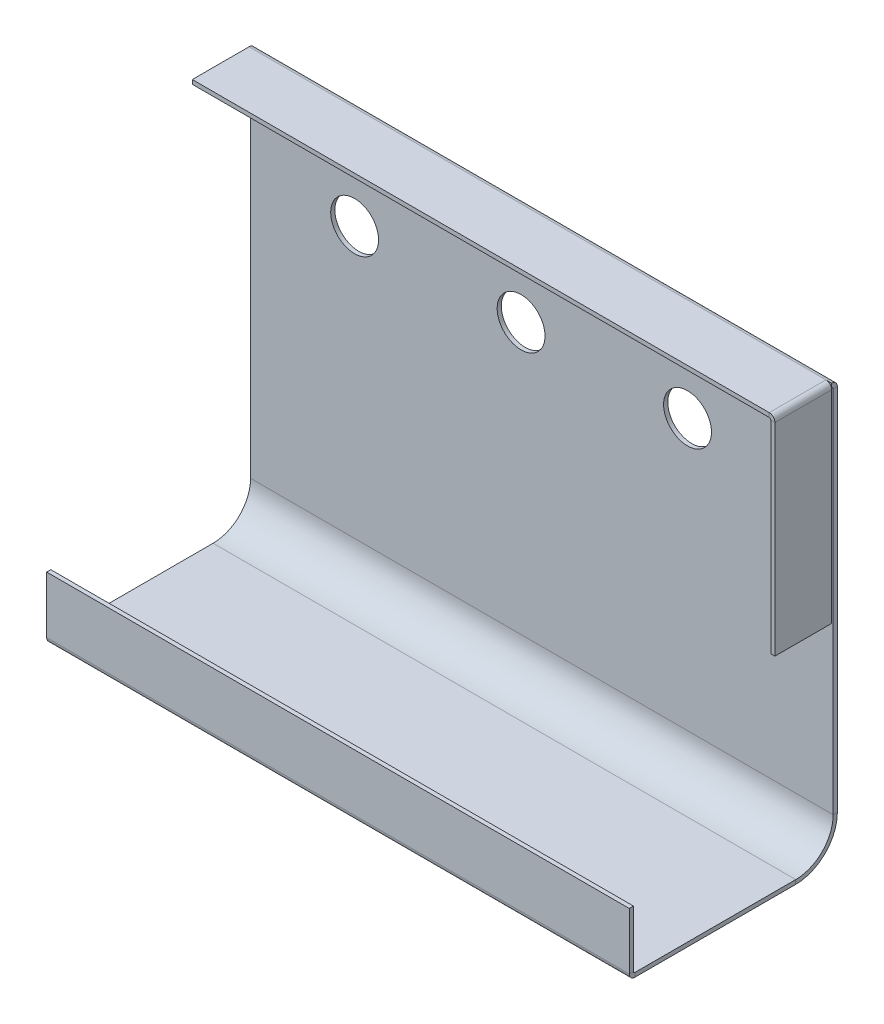
ISO-10303-21;
HEADER;
FILE_DESCRIPTION(('STEP AP214'),'2;1');
FILE_NAME('part.step','',(''),(''),'','','');
FILE_SCHEMA(('AUTOMOTIVE_DESIGN { 1 0 10303 214 1 1 1 1 }'));
ENDSEC;
DATA;
#1=APPLICATION_CONTEXT('core data for automotive mechanical design processes');
#2=APPLICATION_PROTOCOL_DEFINITION('international standard','automotive_design',2000,#1);
#3=PRODUCT_CONTEXT('',#1,'mechanical');
#4=PRODUCT('Part','Part','',(#3));
#5=PRODUCT_RELATED_PRODUCT_CATEGORY('part','',(#4));
#6=PRODUCT_DEFINITION_FORMATION('','',#4);
#7=PRODUCT_DEFINITION_CONTEXT('part definition',#1,'design');
#8=PRODUCT_DEFINITION('design','',#6,#7);
#9=PRODUCT_DEFINITION_SHAPE('','',#8);
#10=(LENGTH_UNIT() NAMED_UNIT(*) SI_UNIT(.MILLI.,.METRE.));
#11=(NAMED_UNIT(*) PLANE_ANGLE_UNIT() SI_UNIT($,.RADIAN.));
#12=(NAMED_UNIT(*) SI_UNIT($,.STERADIAN.) SOLID_ANGLE_UNIT());
#13=UNCERTAINTY_MEASURE_WITH_UNIT(LENGTH_MEASURE(1.E-05),#10,'distance_accuracy_value','');
#14=(GEOMETRIC_REPRESENTATION_CONTEXT(3) GLOBAL_UNCERTAINTY_ASSIGNED_CONTEXT((#13)) GLOBAL_UNIT_ASSIGNED_CONTEXT((#10,
#11,#12)) REPRESENTATION_CONTEXT('',''));
#15=CARTESIAN_POINT('',(0.,0.,0.));
#16=DIRECTION('',(0.,0.,1.));
#17=DIRECTION('',(1.,0.,0.));
#18=AXIS2_PLACEMENT_3D('',#15,#16,#17);
#19=CARTESIAN_POINT('',(137.2634,98.0000000000001,0.736600000000007));
#20=DIRECTION('',(0.,0.,1.));
#21=DIRECTION('',(0.,-1.,0.));
#22=AXIS2_PLACEMENT_3D('',#19,#20,#21);
#23=PLANE('',#22);
#24=DIRECTION('',(-1.,0.,0.));
#25=VECTOR('',#24,1.);
#26=CARTESIAN_POINT('',(0.,100.,0.73659999999999));
#27=LINE('',#26,#25);
#28=CARTESIAN_POINT('',(140.,100.,0.7366));
#29=VERTEX_POINT('',#28);
#30=CARTESIAN_POINT('',(137.2634,100.,0.736600000000007));
#31=VERTEX_POINT('',#30);
#32=EDGE_CURVE('E411',#29,#31,#27,.T.);
#33=ORIENTED_EDGE('',*,*,#32,.T.);
#34=CARTESIAN_POINT('',(137.2634,97.2634000000001,0.736600000000007));
#35=DIRECTION('',(0.,0.,1.));
#36=DIRECTION('',(1.,0.,0.));
#37=AXIS2_PLACEMENT_3D('',#34,#35,#36);
#38=CIRCLE('',#37,2.7366);
#39=CARTESIAN_POINT('',(139.899002397935,98.,0.736600000000007));
#40=VERTEX_POINT('',#39);
#41=EDGE_CURVE('E315',#31,#40,#38,.F.);
#42=ORIENTED_EDGE('',*,*,#41,.T.);
#43=DIRECTION('',(1.,0.,0.));
#44=VECTOR('',#43,1.);
#45=CARTESIAN_POINT('',(140.,98.,0.736600000000004));
#46=LINE('',#45,#44);
#47=CARTESIAN_POINT('',(140.,98.,0.736600000000007));
#48=VERTEX_POINT('',#47);
#49=EDGE_CURVE('E418',#48,#40,#46,.F.);
#50=ORIENTED_EDGE('',*,*,#49,.F.);
#51=DIRECTION('',(0.,1.,0.));
#52=VECTOR('',#51,1.);
#53=CARTESIAN_POINT('',(140.,100.,0.736599999999997));
#54=LINE('',#53,#52);
#55=EDGE_CURVE('E394',#48,#29,#54,.T.);
#56=ORIENTED_EDGE('',*,*,#55,.T.);
#57=EDGE_LOOP('',(#33,#42,#50,#56));
#58=FACE_BOUND('',#57,.T.);
#59=ADVANCED_FACE('F119',(#58),#23,.T.);
#60=CARTESIAN_POINT('',(0.,100.,-3.53927657873048E-13));
#61=DIRECTION('',(0.,1.,0.));
#62=DIRECTION('',(0.,0.,1.));
#63=AXIS2_PLACEMENT_3D('',#60,#61,#62);
#64=PLANE('',#63);
#65=DIRECTION('',(-1.,0.,0.));
#66=VECTOR('',#65,1.);
#67=CARTESIAN_POINT('',(-140.,100.,28.));
#68=LINE('',#67,#66);
#69=CARTESIAN_POINT('',(137.2634,100.,28.));
#70=VERTEX_POINT('',#69);
#71=CARTESIAN_POINT('',(-140.,100.,28.));
#72=VERTEX_POINT('',#71);
#73=EDGE_CURVE('E404',#70,#72,#68,.T.);
#74=ORIENTED_EDGE('',*,*,#73,.F.);
#75=DIRECTION('',(0.,0.,1.));
#76=VECTOR('',#75,1.);
#77=CARTESIAN_POINT('',(137.2634,100.,28.));
#78=LINE('',#77,#76);
#79=EDGE_CURVE('E310',#70,#31,#78,.F.);
#80=ORIENTED_EDGE('',*,*,#79,.T.);
#81=CARTESIAN_POINT('',(-140.,100.,0.736599999999983));
#82=VERTEX_POINT('',#81);
#83=EDGE_CURVE('E414',#31,#82,#27,.T.);
#84=ORIENTED_EDGE('',*,*,#83,.T.);
#85=DIRECTION('',(0.,0.,-1.));
#86=VECTOR('',#85,1.);
#87=CARTESIAN_POINT('',(-140.,100.,0.));
#88=LINE('',#87,#86);
#89=EDGE_CURVE('E401',#72,#82,#88,.T.);
#90=ORIENTED_EDGE('',*,*,#89,.F.);
#91=EDGE_LOOP('',(#74,#80,#84,#90));
#92=FACE_BOUND('',#91,.T.);
#93=ADVANCED_FACE('F536',(#92),#64,.T.);
#94=CARTESIAN_POINT('',(0.,98.,-3.46944695195361E-13));
#95=DIRECTION('',(0.,1.,0.));
#96=DIRECTION('',(0.,0.,1.));
#97=AXIS2_PLACEMENT_3D('',#94,#95,#96);
#98=PLANE('',#97);
#99=DIRECTION('',(0.,0.,1.));
#100=VECTOR('',#99,1.);
#101=CARTESIAN_POINT('',(137.2634,98.0000000000001,28.));
#102=LINE('',#101,#100);
#103=CARTESIAN_POINT('',(137.2634,98.0000000000001,28.));
#104=VERTEX_POINT('',#103);
#105=CARTESIAN_POINT('',(137.2634,98.0000000000001,0.736600000000007));
#106=VERTEX_POINT('',#105);
#107=EDGE_CURVE('E324',#104,#106,#102,.F.);
#108=ORIENTED_EDGE('',*,*,#107,.F.);
#109=DIRECTION('',(1.,0.,0.));
#110=VECTOR('',#109,1.);
#111=CARTESIAN_POINT('',(0.,98.0000000000001,28.));
#112=LINE('',#111,#110);
#113=CARTESIAN_POINT('',(-140.,98.0000000000001,28.));
#114=VERTEX_POINT('',#113);
#115=EDGE_CURVE('E409',#104,#114,#112,.F.);
#116=ORIENTED_EDGE('',*,*,#115,.T.);
#117=DIRECTION('',(0.,0.,1.));
#118=VECTOR('',#117,1.);
#119=CARTESIAN_POINT('',(-140.,98.,-3.46944695195361E-13));
#120=LINE('',#119,#118);
#121=CARTESIAN_POINT('',(-140.,98.,0.736599999999987));
#122=VERTEX_POINT('',#121);
#123=EDGE_CURVE('E406',#114,#122,#120,.F.);
#124=ORIENTED_EDGE('',*,*,#123,.T.);
#125=EDGE_CURVE('E422',#106,#122,#46,.F.);
#126=ORIENTED_EDGE('',*,*,#125,.F.);
#127=EDGE_LOOP('',(#108,#116,#124,#126));
#128=FACE_BOUND('',#127,.T.);
#129=ADVANCED_FACE('F551',(#128),#98,.F.);
#130=CARTESIAN_POINT('',(-140.,100.,28.));
#131=DIRECTION('',(0.,0.,1.));
#132=DIRECTION('',(0.,-1.,0.));
#133=AXIS2_PLACEMENT_3D('',#130,#131,#132);
#134=PLANE('',#133);
#135=ORIENTED_EDGE('',*,*,#115,.F.);
#136=DIRECTION('',(0.,1.,0.));
#137=VECTOR('',#136,1.);
#138=CARTESIAN_POINT('',(137.2634,98.0000000000001,28.));
#139=LINE('',#138,#137);
#140=EDGE_CURVE('E318',#104,#70,#139,.T.);
#141=ORIENTED_EDGE('',*,*,#140,.T.);
#142=ORIENTED_EDGE('',*,*,#73,.T.);
#143=DIRECTION('',(0.,-1.,0.));
#144=VECTOR('',#143,1.);
#145=CARTESIAN_POINT('',(-140.,100.,28.));
#146=LINE('',#145,#144);
#147=EDGE_CURVE('E397',#72,#114,#146,.T.);
#148=ORIENTED_EDGE('',*,*,#147,.T.);
#149=EDGE_LOOP('',(#135,#141,#142,#148));
#150=FACE_BOUND('',#149,.T.);
#151=ADVANCED_FACE('F546',(#150),#134,.T.);
#152=CARTESIAN_POINT('',(140.,-100.,0.));
#153=DIRECTION('',(1.,0.,0.));
#154=DIRECTION('',(0.,0.,-1.));
#155=AXIS2_PLACEMENT_3D('',#152,#153,#154);
#156=PLANE('',#155);
#157=DIRECTION('',(0.,0.,1.));
#158=VECTOR('',#157,1.);
#159=CARTESIAN_POINT('',(140.,-98.,-3.54025199178943E-13));
#160=LINE('',#159,#158);
#161=CARTESIAN_POINT('',(140.,-98.0000000000003,95.2633999999993));
#162=VERTEX_POINT('',#161);
#163=CARTESIAN_POINT('',(140.,-98.0000000000001,17.9999999999999));
#164=VERTEX_POINT('',#163);
#165=EDGE_CURVE('E453',#162,#164,#160,.F.);
#166=ORIENTED_EDGE('',*,*,#165,.F.);
#167=DIRECTION('',(0.,-1.,0.));
#168=VECTOR('',#167,1.);
#169=CARTESIAN_POINT('',(140.,-98.0000000000003,95.2633999999993));
#170=LINE('',#169,#168);
#171=CARTESIAN_POINT('',(140.,-100.,95.2633999999993));
#172=VERTEX_POINT('',#171);
#173=EDGE_CURVE('E382',#162,#172,#170,.T.);
#174=ORIENTED_EDGE('',*,*,#173,.T.);
#175=DIRECTION('',(0.,0.,-1.));
#176=VECTOR('',#175,1.);
#177=CARTESIAN_POINT('',(140.,-100.,0.));
#178=LINE('',#177,#176);
#179=CARTESIAN_POINT('',(140.,-100.,17.9999999999999));
#180=VERTEX_POINT('',#179);
#181=EDGE_CURVE('E447',#172,#180,#178,.T.);
#182=ORIENTED_EDGE('',*,*,#181,.T.);
#183=DIRECTION('',(0.,-1.,0.));
#184=VECTOR('',#183,1.);
#185=CARTESIAN_POINT('',(140.,-98.,17.9999999999999));
#186=LINE('',#185,#184);
#187=EDGE_CURVE('E461',#164,#180,#186,.T.);
#188=ORIENTED_EDGE('',*,*,#187,.F.);
#189=EDGE_LOOP('',(#166,#174,#182,#188));
#190=FACE_BOUND('',#189,.T.);
#191=ADVANCED_FACE('F697',(#190),#156,.T.);
#192=CARTESIAN_POINT('',(0.,-100.,-3.61008161856629E-13));
#193=DIRECTION('',(0.,-1.,0.));
#194=DIRECTION('',(0.,0.,-1.));
#195=AXIS2_PLACEMENT_3D('',#192,#193,#194);
#196=PLANE('',#195);
#197=ORIENTED_EDGE('',*,*,#181,.F.);
#198=DIRECTION('',(1.,0.,0.));
#199=VECTOR('',#198,1.);
#200=CARTESIAN_POINT('',(140.,-100.,95.2633999999993));
#201=LINE('',#200,#199);
#202=CARTESIAN_POINT('',(-140.,-100.,95.2633999999993));
#203=VERTEX_POINT('',#202);
#204=EDGE_CURVE('E377',#172,#203,#201,.F.);
#205=ORIENTED_EDGE('',*,*,#204,.T.);
#206=DIRECTION('',(0.,0.,1.));
#207=VECTOR('',#206,1.);
#208=CARTESIAN_POINT('',(-140.,-100.,97.9999999999993));
#209=LINE('',#208,#207);
#210=CARTESIAN_POINT('',(-140.,-100.,17.9999999999999));
#211=VERTEX_POINT('',#210);
#212=EDGE_CURVE('E450',#211,#203,#209,.T.);
#213=ORIENTED_EDGE('',*,*,#212,.F.);
#214=DIRECTION('',(1.,0.,0.));
#215=VECTOR('',#214,1.);
#216=CARTESIAN_POINT('',(0.,-100.,17.9999999999999));
#217=LINE('',#216,#215);
#218=EDGE_CURVE('E458',#211,#180,#217,.T.);
#219=ORIENTED_EDGE('',*,*,#218,.T.);
#220=EDGE_LOOP('',(#197,#205,#213,#219));
#221=FACE_BOUND('',#220,.T.);
#222=ADVANCED_FACE('F612',(#221),#196,.T.);
#223=CARTESIAN_POINT('',(0.,-98.,-3.54025199178943E-13));
#224=DIRECTION('',(0.,-1.,0.));
#225=DIRECTION('',(0.,0.,-1.));
#226=AXIS2_PLACEMENT_3D('',#223,#224,#225);
#227=PLANE('',#226);
#228=DIRECTION('',(1.,0.,0.));
#229=VECTOR('',#228,1.);
#230=CARTESIAN_POINT('',(140.,-98.0000000000003,95.2633999999993));
#231=LINE('',#230,#229);
#232=CARTESIAN_POINT('',(-140.,-98.0000000000003,95.2633999999993));
#233=VERTEX_POINT('',#232);
#234=EDGE_CURVE('E388',#162,#233,#231,.F.);
#235=ORIENTED_EDGE('',*,*,#234,.F.);
#236=ORIENTED_EDGE('',*,*,#165,.T.);
#237=DIRECTION('',(-1.,0.,0.));
#238=VECTOR('',#237,1.);
#239=CARTESIAN_POINT('',(-140.,-98.0000000000001,17.9999999999999));
#240=LINE('',#239,#238);
#241=CARTESIAN_POINT('',(-140.,-98.0000000000001,17.9999999999999));
#242=VERTEX_POINT('',#241);
#243=EDGE_CURVE('E464',#242,#164,#240,.F.);
#244=ORIENTED_EDGE('',*,*,#243,.F.);
#245=DIRECTION('',(0.,0.,-1.));
#246=VECTOR('',#245,1.);
#247=CARTESIAN_POINT('',(-140.,-98.,-3.54025199178943E-13));
#248=LINE('',#247,#246);
#249=EDGE_CURVE('E455',#242,#233,#248,.F.);
#250=ORIENTED_EDGE('',*,*,#249,.T.);
#251=EDGE_LOOP('',(#235,#236,#244,#250));
#252=FACE_BOUND('',#251,.T.);
#253=ADVANCED_FACE('F589',(#252),#227,.F.);
#254=CARTESIAN_POINT('',(0.,0.,-2.));
#255=DIRECTION('',(0.,0.,1.));
#256=DIRECTION('',(1.,0.,0.));
#257=AXIS2_PLACEMENT_3D('',#254,#255,#256);
#258=PLANE('',#257);
#259=CARTESIAN_POINT('',(106.999999999997,91.9999999999916,-2.));
#260=DIRECTION('',(0.,0.,-1.));
#261=DIRECTION('',(-1.,0.,0.));
#262=AXIS2_PLACEMENT_3D('',#259,#260,#261);
#263=CIRCLE('',#262,1.65);
#264=CARTESIAN_POINT('',(105.349999999997,91.9999999999916,-2.));
#265=VERTEX_POINT('',#264);
#266=EDGE_CURVE('E570',#265,#265,#263,.T.);
#267=ORIENTED_EDGE('',*,*,#266,.F.);
#268=EDGE_LOOP('',(#267));
#269=FACE_BOUND('',#268,.T.);
#270=CARTESIAN_POINT('',(-113.000000000003,91.9999999999922,-2.));
#271=DIRECTION('',(0.,0.,-1.));
#272=DIRECTION('',(-1.,0.,0.));
#273=AXIS2_PLACEMENT_3D('',#270,#271,#272);
#274=CIRCLE('',#273,1.65);
#275=CARTESIAN_POINT('',(-114.650000000003,91.9999999999922,-2.));
#276=VERTEX_POINT('',#275);
#277=EDGE_CURVE('E567',#276,#276,#274,.T.);
#278=ORIENTED_EDGE('',*,*,#277,.F.);
#279=EDGE_LOOP('',(#278));
#280=FACE_BOUND('',#279,.T.);
#281=CARTESIAN_POINT('',(-10.,50.,-2.));
#282=DIRECTION('',(0.,0.,-1.));
#283=DIRECTION('',(-1.,0.,0.));
#284=AXIS2_PLACEMENT_3D('',#281,#282,#283);
#285=CIRCLE('',#284,11.5);
#286=CARTESIAN_POINT('',(-21.5,50.,-2.));
#287=VERTEX_POINT('',#286);
#288=EDGE_CURVE('E333',#287,#287,#285,.T.);
#289=ORIENTED_EDGE('',*,*,#288,.F.);
#290=EDGE_LOOP('',(#289));
#291=FACE_BOUND('',#290,.T.);
#292=CARTESIAN_POINT('',(-90.,50.,-2.));
#293=DIRECTION('',(0.,0.,-1.));
#294=DIRECTION('',(-1.,0.,0.));
#295=AXIS2_PLACEMENT_3D('',#292,#293,#294);
#296=CIRCLE('',#295,11.5);
#297=CARTESIAN_POINT('',(-101.5,50.,-2.));
#298=VERTEX_POINT('',#297);
#299=EDGE_CURVE('E332',#298,#298,#296,.T.);
#300=ORIENTED_EDGE('',*,*,#299,.F.);
#301=EDGE_LOOP('',(#300));
#302=FACE_BOUND('',#301,.T.);
#303=CARTESIAN_POINT('',(70.,50.,-2.));
#304=DIRECTION('',(0.,0.,-1.));
#305=DIRECTION('',(-1.,0.,0.));
#306=AXIS2_PLACEMENT_3D('',#303,#304,#305);
#307=CIRCLE('',#306,11.5);
#308=CARTESIAN_POINT('',(58.5,50.,-2.));
#309=VERTEX_POINT('',#308);
#310=EDGE_CURVE('E339',#309,#309,#307,.T.);
#311=ORIENTED_EDGE('',*,*,#310,.F.);
#312=EDGE_LOOP('',(#311));
#313=FACE_BOUND('',#312,.T.);
#314=DIRECTION('',(-1.,0.,0.));
#315=VECTOR('',#314,1.);
#316=CARTESIAN_POINT('',(-140.,97.2634,-2.00000000000001));
#317=LINE('',#316,#315);
#318=CARTESIAN_POINT('',(-140.,97.2634,-2.00000000000001));
#319=VERTEX_POINT('',#318);
#320=CARTESIAN_POINT('',(140.,97.2634,-2.));
#321=VERTEX_POINT('',#320);
#322=EDGE_CURVE('E424',#319,#321,#317,.F.);
#323=ORIENTED_EDGE('',*,*,#322,.T.);
#324=DIRECTION('',(0.,1.,0.));
#325=VECTOR('',#324,1.);
#326=CARTESIAN_POINT('',(140.,100.,-2.));
#327=LINE('',#326,#325);
#328=CARTESIAN_POINT('',(140.,-80.0000000000001,-2.00000000000001));
#329=VERTEX_POINT('',#328);
#330=EDGE_CURVE('E128',#329,#321,#327,.T.);
#331=ORIENTED_EDGE('',*,*,#330,.F.);
#332=DIRECTION('',(1.,0.,0.));
#333=VECTOR('',#332,1.);
#334=CARTESIAN_POINT('',(140.,-80.0000000000001,-2.00000000000001));
#335=LINE('',#334,#333);
#336=CARTESIAN_POINT('',(-140.,-80.,-2.));
#337=VERTEX_POINT('',#336);
#338=EDGE_CURVE('E469',#329,#337,#335,.F.);
#339=ORIENTED_EDGE('',*,*,#338,.T.);
#340=DIRECTION('',(0.,-1.,0.));
#341=VECTOR('',#340,1.);
#342=CARTESIAN_POINT('',(-140.,100.,-2.));
#343=LINE('',#342,#341);
#344=EDGE_CURVE('E13',#319,#337,#343,.T.);
#345=ORIENTED_EDGE('',*,*,#344,.F.);
#346=EDGE_LOOP('',(#323,#331,#339,#345));
#347=FACE_BOUND('',#346,.T.);
#348=ADVANCED_FACE('F509',(#269,#280,#291,#302,#313,#347),#258,.F.);
#349=CARTESIAN_POINT('',(0.,0.,0.));
#350=DIRECTION('',(0.,0.,1.));
#351=DIRECTION('',(1.,0.,0.));
#352=AXIS2_PLACEMENT_3D('',#349,#350,#351);
#353=PLANE('',#352);
#354=CARTESIAN_POINT('',(106.999999999997,91.9999999999916,0.));
#355=DIRECTION('',(0.,0.,1.));
#356=DIRECTION('',(1.,0.,0.));
#357=AXIS2_PLACEMENT_3D('',#354,#355,#356);
#358=CIRCLE('',#357,1.64999999999999);
#359=CARTESIAN_POINT('',(108.649999999997,91.9999999999916,0.));
#360=VERTEX_POINT('',#359);
#361=EDGE_CURVE('E123',#360,#360,#358,.T.);
#362=ORIENTED_EDGE('',*,*,#361,.F.);
#363=EDGE_LOOP('',(#362));
#364=FACE_BOUND('',#363,.T.);
#365=CARTESIAN_POINT('',(-113.000000000003,91.9999999999922,0.));
#366=DIRECTION('',(0.,0.,1.));
#367=DIRECTION('',(1.,0.,0.));
#368=AXIS2_PLACEMENT_3D('',#365,#366,#367);
#369=CIRCLE('',#368,1.64999999999999);
#370=CARTESIAN_POINT('',(-111.350000000003,91.9999999999922,0.));
#371=VERTEX_POINT('',#370);
#372=EDGE_CURVE('E309',#371,#371,#369,.T.);
#373=ORIENTED_EDGE('',*,*,#372,.F.);
#374=EDGE_LOOP('',(#373));
#375=FACE_BOUND('',#374,.T.);
#376=CARTESIAN_POINT('',(-10.,50.,0.));
#377=DIRECTION('',(0.,0.,1.));
#378=DIRECTION('',(1.,0.,0.));
#379=AXIS2_PLACEMENT_3D('',#376,#377,#378);
#380=CIRCLE('',#379,11.5);
#381=CARTESIAN_POINT('',(1.49999999999997,50.,0.));
#382=VERTEX_POINT('',#381);
#383=EDGE_CURVE('E343',#382,#382,#380,.T.);
#384=ORIENTED_EDGE('',*,*,#383,.F.);
#385=EDGE_LOOP('',(#384));
#386=FACE_BOUND('',#385,.T.);
#387=CARTESIAN_POINT('',(-90.,50.,0.));
#388=DIRECTION('',(0.,0.,1.));
#389=DIRECTION('',(1.,0.,0.));
#390=AXIS2_PLACEMENT_3D('',#387,#388,#389);
#391=CIRCLE('',#390,11.5);
#392=CARTESIAN_POINT('',(-78.5000000000001,50.,0.));
#393=VERTEX_POINT('',#392);
#394=EDGE_CURVE('E336',#393,#393,#391,.T.);
#395=ORIENTED_EDGE('',*,*,#394,.F.);
#396=EDGE_LOOP('',(#395));
#397=FACE_BOUND('',#396,.T.);
#398=CARTESIAN_POINT('',(70.,50.,0.));
#399=DIRECTION('',(0.,0.,1.));
#400=DIRECTION('',(1.,0.,0.));
#401=AXIS2_PLACEMENT_3D('',#398,#399,#400);
#402=CIRCLE('',#401,11.5);
#403=CARTESIAN_POINT('',(81.5,50.,0.));
#404=VERTEX_POINT('',#403);
#405=EDGE_CURVE('E342',#404,#404,#402,.T.);
#406=ORIENTED_EDGE('',*,*,#405,.F.);
#407=EDGE_LOOP('',(#406));
#408=FACE_BOUND('',#407,.T.);
#409=DIRECTION('',(0.,1.,0.));
#410=VECTOR('',#409,1.);
#411=CARTESIAN_POINT('',(140.,100.,0.));
#412=LINE('',#411,#410);
#413=CARTESIAN_POINT('',(140.,-80.0000000000001,0.));
#414=VERTEX_POINT('',#413);
#415=CARTESIAN_POINT('',(140.,97.2634,0.));
#416=VERTEX_POINT('',#415);
#417=EDGE_CURVE('E488',#414,#416,#412,.T.);
#418=ORIENTED_EDGE('',*,*,#417,.T.);
#419=DIRECTION('',(-1.,0.,0.));
#420=VECTOR('',#419,1.);
#421=CARTESIAN_POINT('',(-140.,97.2634,0.));
#422=LINE('',#421,#420);
#423=CARTESIAN_POINT('',(-140.,97.2634,0.));
#424=VERTEX_POINT('',#423);
#425=EDGE_CURVE('E436',#424,#416,#422,.F.);
#426=ORIENTED_EDGE('',*,*,#425,.F.);
#427=DIRECTION('',(0.,-1.,0.));
#428=VECTOR('',#427,1.);
#429=CARTESIAN_POINT('',(-140.,100.,0.));
#430=LINE('',#429,#428);
#431=CARTESIAN_POINT('',(-140.,-80.0000000000001,0.));
#432=VERTEX_POINT('',#431);
#433=EDGE_CURVE('E492',#424,#432,#430,.T.);
#434=ORIENTED_EDGE('',*,*,#433,.T.);
#435=DIRECTION('',(1.,0.,0.));
#436=VECTOR('',#435,1.);
#437=CARTESIAN_POINT('',(140.,-80.0000000000001,0.));
#438=LINE('',#437,#436);
#439=EDGE_CURVE('E144',#414,#432,#438,.F.);
#440=ORIENTED_EDGE('',*,*,#439,.F.);
#441=EDGE_LOOP('',(#418,#426,#434,#440));
#442=FACE_BOUND('',#441,.T.);
#443=ADVANCED_FACE('F505',(#364,#375,#386,#397,#408,#442),#353,.T.);
#444=CARTESIAN_POINT('',(-140.,100.,-2.));
#445=DIRECTION('',(-1.,0.,0.));
#446=DIRECTION('',(0.,-1.,0.));
#447=AXIS2_PLACEMENT_3D('',#444,#445,#446);
#448=PLANE('',#447);
#449=ORIENTED_EDGE('',*,*,#433,.F.);
#450=DIRECTION('',(0.,0.,-1.));
#451=VECTOR('',#450,1.);
#452=CARTESIAN_POINT('',(-140.,97.2634,0.));
#453=LINE('',#452,#451);
#454=EDGE_CURVE('E430',#424,#319,#453,.T.);
#455=ORIENTED_EDGE('',*,*,#454,.T.);
#456=ORIENTED_EDGE('',*,*,#344,.T.);
#457=DIRECTION('',(0.,0.,-1.));
#458=VECTOR('',#457,1.);
#459=CARTESIAN_POINT('',(-140.,-80.0000000000001,0.));
#460=LINE('',#459,#458);
#461=EDGE_CURVE('E485',#432,#337,#460,.T.);
#462=ORIENTED_EDGE('',*,*,#461,.F.);
#463=EDGE_LOOP('',(#449,#455,#456,#462));
#464=FACE_BOUND('',#463,.T.);
#465=ADVANCED_FACE('F508',(#464),#448,.T.);
#466=CARTESIAN_POINT('',(140.,100.,-2.));
#467=DIRECTION('',(1.,0.,0.));
#468=DIRECTION('',(0.,0.,-1.));
#469=AXIS2_PLACEMENT_3D('',#466,#467,#468);
#470=PLANE('',#469);
#471=DIRECTION('',(0.,0.,-1.));
#472=VECTOR('',#471,1.);
#473=CARTESIAN_POINT('',(140.,97.2634,0.));
#474=LINE('',#473,#472);
#475=EDGE_CURVE('E441',#416,#321,#474,.T.);
#476=ORIENTED_EDGE('',*,*,#475,.F.);
#477=ORIENTED_EDGE('',*,*,#417,.F.);
#478=DIRECTION('',(0.,0.,-1.));
#479=VECTOR('',#478,1.);
#480=CARTESIAN_POINT('',(140.,-80.0000000000001,0.));
#481=LINE('',#480,#479);
#482=EDGE_CURVE('E476',#414,#329,#481,.T.);
#483=ORIENTED_EDGE('',*,*,#482,.T.);
#484=ORIENTED_EDGE('',*,*,#330,.T.);
#485=EDGE_LOOP('',(#476,#477,#483,#484));
#486=FACE_BOUND('',#485,.T.);
#487=ADVANCED_FACE('F121',(#486),#470,.T.);
#488=CARTESIAN_POINT('',(-140.,-80.0000000000001,18.));
#489=DIRECTION('',(-1.,0.,0.));
#490=DIRECTION('',(0.,0.,1.));
#491=AXIS2_PLACEMENT_3D('',#488,#489,#490);
#492=PLANE('',#491);
#493=DIRECTION('',(0.,-1.,0.));
#494=VECTOR('',#493,1.);
#495=CARTESIAN_POINT('',(-140.,-100.,17.9999999999999));
#496=LINE('',#495,#494);
#497=EDGE_CURVE('E444',#242,#211,#496,.T.);
#498=ORIENTED_EDGE('',*,*,#497,.F.);
#499=CARTESIAN_POINT('',(-140.,-80.0000000000001,18.));
#500=DIRECTION('',(1.,0.,0.));
#501=DIRECTION('',(0.,0.,-1.));
#502=AXIS2_PLACEMENT_3D('',#499,#500,#501);
#503=CIRCLE('',#502,18.);
#504=EDGE_CURVE('E479',#432,#242,#503,.F.);
#505=ORIENTED_EDGE('',*,*,#504,.F.);
#506=ORIENTED_EDGE('',*,*,#461,.T.);
#507=CARTESIAN_POINT('',(-140.,-80.0000000000001,18.));
#508=DIRECTION('',(1.,0.,0.));
#509=DIRECTION('',(0.,0.,-1.));
#510=AXIS2_PLACEMENT_3D('',#507,#508,#509);
#511=CIRCLE('',#510,20.);
#512=EDGE_CURVE('E472',#337,#211,#511,.F.);
#513=ORIENTED_EDGE('',*,*,#512,.T.);
#514=EDGE_LOOP('',(#498,#505,#506,#513));
#515=FACE_BOUND('',#514,.T.);
#516=ADVANCED_FACE('F614',(#515),#492,.T.);
#517=CARTESIAN_POINT('',(140.,-80.0000000000001,18.));
#518=DIRECTION('',(-1.,0.,0.));
#519=DIRECTION('',(0.,0.,1.));
#520=AXIS2_PLACEMENT_3D('',#517,#518,#519);
#521=PLANE('',#520);
#522=CARTESIAN_POINT('',(140.,-80.0000000000001,18.));
#523=DIRECTION('',(1.,0.,0.));
#524=DIRECTION('',(0.,0.,-1.));
#525=AXIS2_PLACEMENT_3D('',#522,#523,#524);
#526=CIRCLE('',#525,18.);
#527=EDGE_CURVE('E449',#164,#414,#526,.T.);
#528=ORIENTED_EDGE('',*,*,#527,.F.);
#529=ORIENTED_EDGE('',*,*,#187,.T.);
#530=CARTESIAN_POINT('',(140.,-80.0000000000001,18.));
#531=DIRECTION('',(1.,0.,0.));
#532=DIRECTION('',(0.,0.,-1.));
#533=AXIS2_PLACEMENT_3D('',#530,#531,#532);
#534=CIRCLE('',#533,20.);
#535=EDGE_CURVE('E473',#180,#329,#534,.T.);
#536=ORIENTED_EDGE('',*,*,#535,.T.);
#537=ORIENTED_EDGE('',*,*,#482,.F.);
#538=EDGE_LOOP('',(#528,#529,#536,#537));
#539=FACE_BOUND('',#538,.T.);
#540=ADVANCED_FACE('F605',(#539),#521,.F.);
#541=CARTESIAN_POINT('',(140.,-80.0000000000001,18.));
#542=DIRECTION('',(1.,0.,0.));
#543=DIRECTION('',(0.,-1.,0.));
#544=AXIS2_PLACEMENT_3D('',#541,#542,#543);
#545=CYLINDRICAL_SURFACE('',#544,20.);
#546=ORIENTED_EDGE('',*,*,#338,.F.);
#547=ORIENTED_EDGE('',*,*,#535,.F.);
#548=ORIENTED_EDGE('',*,*,#218,.F.);
#549=ORIENTED_EDGE('',*,*,#512,.F.);
#550=EDGE_LOOP('',(#546,#547,#548,#549));
#551=FACE_BOUND('',#550,.T.);
#552=ADVANCED_FACE('F604',(#551),#545,.T.);
#553=CARTESIAN_POINT('',(140.,-80.0000000000001,18.));
#554=DIRECTION('',(1.,0.,0.));
#555=DIRECTION('',(0.,-1.,0.));
#556=AXIS2_PLACEMENT_3D('',#553,#554,#555);
#557=CYLINDRICAL_SURFACE('',#556,18.);
#558=ORIENTED_EDGE('',*,*,#439,.T.);
#559=ORIENTED_EDGE('',*,*,#504,.T.);
#560=ORIENTED_EDGE('',*,*,#243,.T.);
#561=ORIENTED_EDGE('',*,*,#527,.T.);
#562=EDGE_LOOP('',(#558,#559,#560,#561));
#563=FACE_BOUND('',#562,.T.);
#564=ADVANCED_FACE('F625',(#563),#557,.F.);
#565=CARTESIAN_POINT('',(-140.,-100.,97.9999999999993));
#566=DIRECTION('',(-1.,0.,0.));
#567=DIRECTION('',(0.,0.,1.));
#568=AXIS2_PLACEMENT_3D('',#565,#566,#567);
#569=PLANE('',#568);
#570=DIRECTION('',(0.,-1.,0.));
#571=VECTOR('',#570,1.);
#572=CARTESIAN_POINT('',(-140.,-98.0000000000003,95.2633999999993));
#573=LINE('',#572,#571);
#574=EDGE_CURVE('E392',#233,#203,#573,.T.);
#575=ORIENTED_EDGE('',*,*,#574,.F.);
#576=ORIENTED_EDGE('',*,*,#249,.F.);
#577=ORIENTED_EDGE('',*,*,#497,.T.);
#578=ORIENTED_EDGE('',*,*,#212,.T.);
#579=EDGE_LOOP('',(#575,#576,#577,#578));
#580=FACE_BOUND('',#579,.T.);
#581=ADVANCED_FACE('F620',(#580),#569,.T.);
#582=CARTESIAN_POINT('',(140.,97.2634,0.73660000000001));
#583=DIRECTION('',(1.,0.,0.));
#584=DIRECTION('',(0.,0.,-1.));
#585=AXIS2_PLACEMENT_3D('',#582,#583,#584);
#586=PLANE('',#585);
#587=ORIENTED_EDGE('',*,*,#55,.F.);
#588=CARTESIAN_POINT('',(140.,97.2634,0.73660000000001));
#589=DIRECTION('',(-1.,0.,0.));
#590=DIRECTION('',(0.,0.,1.));
#591=AXIS2_PLACEMENT_3D('',#588,#589,#590);
#592=CIRCLE('',#591,0.736600000000004);
#593=EDGE_CURVE('E433',#416,#48,#592,.F.);
#594=ORIENTED_EDGE('',*,*,#593,.F.);
#595=ORIENTED_EDGE('',*,*,#475,.T.);
#596=CARTESIAN_POINT('',(140.,97.2634,0.73660000000001));
#597=DIRECTION('',(-1.,0.,0.));
#598=DIRECTION('',(0.,0.,1.));
#599=AXIS2_PLACEMENT_3D('',#596,#597,#598);
#600=CIRCLE('',#599,2.7366);
#601=EDGE_CURVE('E426',#321,#29,#600,.F.);
#602=ORIENTED_EDGE('',*,*,#601,.T.);
#603=EDGE_LOOP('',(#587,#594,#595,#602));
#604=FACE_BOUND('',#603,.T.);
#605=ADVANCED_FACE('F524',(#604),#586,.T.);
#606=CARTESIAN_POINT('',(-140.,97.2634,0.736599999999989));
#607=DIRECTION('',(1.,0.,0.));
#608=DIRECTION('',(0.,0.,-1.));
#609=AXIS2_PLACEMENT_3D('',#606,#607,#608);
#610=PLANE('',#609);
#611=CARTESIAN_POINT('',(-140.,97.2634,0.736599999999989));
#612=DIRECTION('',(-1.,0.,0.));
#613=DIRECTION('',(0.,0.,1.));
#614=AXIS2_PLACEMENT_3D('',#611,#612,#613);
#615=CIRCLE('',#614,0.736600000000004);
#616=EDGE_CURVE('E400',#122,#424,#615,.T.);
#617=ORIENTED_EDGE('',*,*,#616,.F.);
#618=DIRECTION('',(0.,1.,0.));
#619=VECTOR('',#618,1.);
#620=CARTESIAN_POINT('',(-140.,98.,0.73659999999999));
#621=LINE('',#620,#619);
#622=EDGE_CURVE('E415',#122,#82,#621,.T.);
#623=ORIENTED_EDGE('',*,*,#622,.T.);
#624=CARTESIAN_POINT('',(-140.,97.2634,0.736599999999989));
#625=DIRECTION('',(-1.,0.,0.));
#626=DIRECTION('',(0.,0.,1.));
#627=AXIS2_PLACEMENT_3D('',#624,#625,#626);
#628=CIRCLE('',#627,2.7366);
#629=EDGE_CURVE('E427',#82,#319,#628,.T.);
#630=ORIENTED_EDGE('',*,*,#629,.T.);
#631=ORIENTED_EDGE('',*,*,#454,.F.);
#632=EDGE_LOOP('',(#617,#623,#630,#631));
#633=FACE_BOUND('',#632,.T.);
#634=ADVANCED_FACE('F700',(#633),#610,.F.);
#635=CARTESIAN_POINT('',(-140.,97.2634,0.736599999999989));
#636=DIRECTION('',(-1.,0.,0.));
#637=DIRECTION('',(0.,1.,0.));
#638=AXIS2_PLACEMENT_3D('',#635,#636,#637);
#639=CYLINDRICAL_SURFACE('',#638,2.7366);
#640=ORIENTED_EDGE('',*,*,#322,.F.);
#641=ORIENTED_EDGE('',*,*,#629,.F.);
#642=ORIENTED_EDGE('',*,*,#83,.F.);
#643=ORIENTED_EDGE('',*,*,#32,.F.);
#644=ORIENTED_EDGE('',*,*,#601,.F.);
#645=EDGE_LOOP('',(#640,#641,#642,#643,#644));
#646=FACE_BOUND('',#645,.T.);
#647=ADVANCED_FACE('F531',(#646),#639,.T.);
#648=CARTESIAN_POINT('',(-140.,97.2634,0.736599999999989));
#649=DIRECTION('',(-1.,0.,0.));
#650=DIRECTION('',(0.,1.,0.));
#651=AXIS2_PLACEMENT_3D('',#648,#649,#650);
#652=CYLINDRICAL_SURFACE('',#651,0.736600000000004);
#653=ORIENTED_EDGE('',*,*,#425,.T.);
#654=ORIENTED_EDGE('',*,*,#593,.T.);
#655=ORIENTED_EDGE('',*,*,#49,.T.);
#656=EDGE_CURVE('E421',#40,#106,#46,.F.);
#657=ORIENTED_EDGE('',*,*,#656,.T.);
#658=ORIENTED_EDGE('',*,*,#125,.T.);
#659=ORIENTED_EDGE('',*,*,#616,.T.);
#660=EDGE_LOOP('',(#653,#654,#655,#657,#658,#659));
#661=FACE_BOUND('',#660,.T.);
#662=ADVANCED_FACE('F520',(#661),#652,.F.);
#663=CARTESIAN_POINT('',(-140.,100.,0.));
#664=DIRECTION('',(-1.,0.,0.));
#665=DIRECTION('',(0.,0.,1.));
#666=AXIS2_PLACEMENT_3D('',#663,#664,#665);
#667=PLANE('',#666);
#668=ORIENTED_EDGE('',*,*,#89,.T.);
#669=ORIENTED_EDGE('',*,*,#622,.F.);
#670=ORIENTED_EDGE('',*,*,#123,.F.);
#671=ORIENTED_EDGE('',*,*,#147,.F.);
#672=EDGE_LOOP('',(#668,#669,#670,#671));
#673=FACE_BOUND('',#672,.T.);
#674=ADVANCED_FACE('F685',(#673),#667,.T.);
#675=CARTESIAN_POINT('',(-140.,-97.2634000000003,95.2633999999993));
#676=DIRECTION('',(-1.,0.,0.));
#677=DIRECTION('',(0.,0.,1.));
#678=AXIS2_PLACEMENT_3D('',#675,#676,#677);
#679=PLANE('',#678);
#680=DIRECTION('',(0.,0.,1.));
#681=VECTOR('',#680,1.);
#682=CARTESIAN_POINT('',(-140.,-97.2634000000003,97.9999999999995));
#683=LINE('',#682,#681);
#684=CARTESIAN_POINT('',(-140.,-97.2634000000003,95.9999999999993));
#685=VERTEX_POINT('',#684);
#686=CARTESIAN_POINT('',(-140.,-97.2634000000003,97.9999999999993));
#687=VERTEX_POINT('',#686);
#688=EDGE_CURVE('E374',#685,#687,#683,.T.);
#689=ORIENTED_EDGE('',*,*,#688,.F.);
#690=CARTESIAN_POINT('',(-140.,-97.2634000000003,95.2633999999993));
#691=DIRECTION('',(1.,0.,0.));
#692=DIRECTION('',(0.,0.,-1.));
#693=AXIS2_PLACEMENT_3D('',#690,#691,#692);
#694=CIRCLE('',#693,0.736600000000004);
#695=EDGE_CURVE('E385',#233,#685,#694,.F.);
#696=ORIENTED_EDGE('',*,*,#695,.F.);
#697=ORIENTED_EDGE('',*,*,#574,.T.);
#698=CARTESIAN_POINT('',(-140.,-97.2634000000003,95.2633999999993));
#699=DIRECTION('',(1.,0.,0.));
#700=DIRECTION('',(0.,0.,-1.));
#701=AXIS2_PLACEMENT_3D('',#698,#699,#700);
#702=CIRCLE('',#701,2.7366);
#703=EDGE_CURVE('E136',#203,#687,#702,.F.);
#704=ORIENTED_EDGE('',*,*,#703,.T.);
#705=EDGE_LOOP('',(#689,#696,#697,#704));
#706=FACE_BOUND('',#705,.T.);
#707=ADVANCED_FACE('F682',(#706),#679,.T.);
#708=CARTESIAN_POINT('',(140.,-97.2634000000003,95.2633999999993));
#709=DIRECTION('',(-1.,0.,0.));
#710=DIRECTION('',(0.,0.,1.));
#711=AXIS2_PLACEMENT_3D('',#708,#709,#710);
#712=PLANE('',#711);
#713=CARTESIAN_POINT('',(140.,-97.2634000000003,95.2633999999993));
#714=DIRECTION('',(1.,0.,0.));
#715=DIRECTION('',(0.,0.,-1.));
#716=AXIS2_PLACEMENT_3D('',#713,#714,#715);
#717=CIRCLE('',#716,0.736600000000004);
#718=CARTESIAN_POINT('',(140.,-97.2634000000003,95.9999999999993));
#719=VERTEX_POINT('',#718);
#720=EDGE_CURVE('E346',#719,#162,#717,.T.);
#721=ORIENTED_EDGE('',*,*,#720,.F.);
#722=DIRECTION('',(0.,0.,1.));
#723=VECTOR('',#722,1.);
#724=CARTESIAN_POINT('',(140.,-97.2634000000003,95.9999999999993));
#725=LINE('',#724,#723);
#726=CARTESIAN_POINT('',(140.,-97.2634000000003,97.9999999999993));
#727=VERTEX_POINT('',#726);
#728=EDGE_CURVE('E369',#719,#727,#725,.T.);
#729=ORIENTED_EDGE('',*,*,#728,.T.);
#730=CARTESIAN_POINT('',(140.,-97.2634000000003,95.2633999999993));
#731=DIRECTION('',(1.,0.,0.));
#732=DIRECTION('',(0.,0.,-1.));
#733=AXIS2_PLACEMENT_3D('',#730,#731,#732);
#734=CIRCLE('',#733,2.7366);
#735=EDGE_CURVE('E380',#727,#172,#734,.T.);
#736=ORIENTED_EDGE('',*,*,#735,.T.);
#737=ORIENTED_EDGE('',*,*,#173,.F.);
#738=EDGE_LOOP('',(#721,#729,#736,#737));
#739=FACE_BOUND('',#738,.T.);
#740=ADVANCED_FACE('F678',(#739),#712,.F.);
#741=CARTESIAN_POINT('',(140.,-97.2634000000003,95.2633999999993));
#742=DIRECTION('',(1.,0.,0.));
#743=DIRECTION('',(0.,0.,1.));
#744=AXIS2_PLACEMENT_3D('',#741,#742,#743);
#745=CYLINDRICAL_SURFACE('',#744,2.7366);
#746=ORIENTED_EDGE('',*,*,#204,.F.);
#747=ORIENTED_EDGE('',*,*,#735,.F.);
#748=DIRECTION('',(1.,0.,0.));
#749=VECTOR('',#748,1.);
#750=CARTESIAN_POINT('',(0.,-97.2634000000003,97.9999999999993));
#751=LINE('',#750,#749);
#752=EDGE_CURVE('E366',#687,#727,#751,.T.);
#753=ORIENTED_EDGE('',*,*,#752,.F.);
#754=ORIENTED_EDGE('',*,*,#703,.F.);
#755=EDGE_LOOP('',(#746,#747,#753,#754));
#756=FACE_BOUND('',#755,.T.);
#757=ADVANCED_FACE('F675',(#756),#745,.T.);
#758=CARTESIAN_POINT('',(140.,-97.2634000000003,95.2633999999993));
#759=DIRECTION('',(1.,0.,0.));
#760=DIRECTION('',(0.,0.,1.));
#761=AXIS2_PLACEMENT_3D('',#758,#759,#760);
#762=CYLINDRICAL_SURFACE('',#761,0.736600000000004);
#763=ORIENTED_EDGE('',*,*,#234,.T.);
#764=ORIENTED_EDGE('',*,*,#695,.T.);
#765=DIRECTION('',(-1.,0.,0.));
#766=VECTOR('',#765,1.);
#767=CARTESIAN_POINT('',(-140.,-97.2634000000003,95.9999999999993));
#768=LINE('',#767,#766);
#769=EDGE_CURVE('E372',#685,#719,#768,.F.);
#770=ORIENTED_EDGE('',*,*,#769,.T.);
#771=ORIENTED_EDGE('',*,*,#720,.T.);
#772=EDGE_LOOP('',(#763,#764,#770,#771));
#773=FACE_BOUND('',#772,.T.);
#774=ADVANCED_FACE('F667',(#773),#762,.F.);
#775=CARTESIAN_POINT('',(140.,-98.0000000000003,97.9999999999993));
#776=DIRECTION('',(1.,0.,0.));
#777=DIRECTION('',(0.,0.,-1.));
#778=AXIS2_PLACEMENT_3D('',#775,#776,#777);
#779=PLANE('',#778);
#780=DIRECTION('',(0.,-1.,0.));
#781=VECTOR('',#780,1.);
#782=CARTESIAN_POINT('',(140.,-98.0000000000003,97.9999999999993));
#783=LINE('',#782,#781);
#784=CARTESIAN_POINT('',(140.,-70.0000000000003,97.9999999999995));
#785=VERTEX_POINT('',#784);
#786=EDGE_CURVE('E350',#785,#727,#783,.T.);
#787=ORIENTED_EDGE('',*,*,#786,.T.);
#788=ORIENTED_EDGE('',*,*,#728,.F.);
#789=DIRECTION('',(0.,1.,0.));
#790=VECTOR('',#789,1.);
#791=CARTESIAN_POINT('',(140.,-6.7293109859933E-13,96.));
#792=LINE('',#791,#790);
#793=CARTESIAN_POINT('',(140.,-70.0000000000003,95.9999999999995));
#794=VERTEX_POINT('',#793);
#795=EDGE_CURVE('E358',#794,#719,#792,.F.);
#796=ORIENTED_EDGE('',*,*,#795,.F.);
#797=DIRECTION('',(0.,0.,-1.));
#798=VECTOR('',#797,1.);
#799=CARTESIAN_POINT('',(140.,-70.0000000000003,97.9999999999995));
#800=LINE('',#799,#798);
#801=EDGE_CURVE('E344',#785,#794,#800,.T.);
#802=ORIENTED_EDGE('',*,*,#801,.F.);
#803=EDGE_LOOP('',(#787,#788,#796,#802));
#804=FACE_BOUND('',#803,.T.);
#805=ADVANCED_FACE('F664',(#804),#779,.T.);
#806=CARTESIAN_POINT('',(-140.,-70.0000000000003,97.9999999999995));
#807=DIRECTION('',(-1.,0.,0.));
#808=DIRECTION('',(0.,0.,1.));
#809=AXIS2_PLACEMENT_3D('',#806,#807,#808);
#810=PLANE('',#809);
#811=DIRECTION('',(0.,-1.,0.));
#812=VECTOR('',#811,1.);
#813=CARTESIAN_POINT('',(-140.,-6.7293109859933E-13,96.));
#814=LINE('',#813,#812);
#815=CARTESIAN_POINT('',(-140.,-70.0000000000003,95.9999999999995));
#816=VERTEX_POINT('',#815);
#817=EDGE_CURVE('E364',#685,#816,#814,.F.);
#818=ORIENTED_EDGE('',*,*,#817,.F.);
#819=ORIENTED_EDGE('',*,*,#688,.T.);
#820=DIRECTION('',(0.,1.,0.));
#821=VECTOR('',#820,1.);
#822=CARTESIAN_POINT('',(-140.,-70.0000000000003,97.9999999999995));
#823=LINE('',#822,#821);
#824=CARTESIAN_POINT('',(-140.,-70.0000000000003,97.9999999999995));
#825=VERTEX_POINT('',#824);
#826=EDGE_CURVE('E356',#687,#825,#823,.T.);
#827=ORIENTED_EDGE('',*,*,#826,.T.);
#828=DIRECTION('',(0.,0.,-1.));
#829=VECTOR('',#828,1.);
#830=CARTESIAN_POINT('',(-140.,-70.0000000000003,97.9999999999995));
#831=LINE('',#830,#829);
#832=EDGE_CURVE('E347',#825,#816,#831,.T.);
#833=ORIENTED_EDGE('',*,*,#832,.T.);
#834=EDGE_LOOP('',(#818,#819,#827,#833));
#835=FACE_BOUND('',#834,.T.);
#836=ADVANCED_FACE('F659',(#835),#810,.T.);
#837=CARTESIAN_POINT('',(0.,-6.86994565260595E-13,98.));
#838=DIRECTION('',(0.,0.,1.));
#839=DIRECTION('',(0.,-1.,0.));
#840=AXIS2_PLACEMENT_3D('',#837,#838,#839);
#841=PLANE('',#840);
#842=ORIENTED_EDGE('',*,*,#826,.F.);
#843=ORIENTED_EDGE('',*,*,#752,.T.);
#844=ORIENTED_EDGE('',*,*,#786,.F.);
#845=DIRECTION('',(1.,0.,0.));
#846=VECTOR('',#845,1.);
#847=CARTESIAN_POINT('',(140.,-70.0000000000003,97.9999999999995));
#848=LINE('',#847,#846);
#849=EDGE_CURVE('E353',#825,#785,#848,.T.);
#850=ORIENTED_EDGE('',*,*,#849,.F.);
#851=EDGE_LOOP('',(#842,#843,#844,#850));
#852=FACE_BOUND('',#851,.T.);
#853=ADVANCED_FACE('F655',(#852),#841,.T.);
#854=CARTESIAN_POINT('',(0.,-6.7293109859933E-13,96.));
#855=DIRECTION('',(0.,0.,1.));
#856=DIRECTION('',(0.,-1.,0.));
#857=AXIS2_PLACEMENT_3D('',#854,#855,#856);
#858=PLANE('',#857);
#859=ORIENTED_EDGE('',*,*,#769,.F.);
#860=ORIENTED_EDGE('',*,*,#817,.T.);
#861=DIRECTION('',(-1.,0.,0.));
#862=VECTOR('',#861,1.);
#863=CARTESIAN_POINT('',(0.,-70.0000000000003,95.9999999999995));
#864=LINE('',#863,#862);
#865=EDGE_CURVE('E361',#816,#794,#864,.F.);
#866=ORIENTED_EDGE('',*,*,#865,.T.);
#867=ORIENTED_EDGE('',*,*,#795,.T.);
#868=EDGE_LOOP('',(#859,#860,#866,#867));
#869=FACE_BOUND('',#868,.T.);
#870=ADVANCED_FACE('F658',(#869),#858,.F.);
#871=CARTESIAN_POINT('',(140.,-70.0000000000003,97.9999999999995));
#872=DIRECTION('',(0.,1.,0.));
#873=DIRECTION('',(0.,0.,1.));
#874=AXIS2_PLACEMENT_3D('',#871,#872,#873);
#875=PLANE('',#874);
#876=ORIENTED_EDGE('',*,*,#865,.F.);
#877=ORIENTED_EDGE('',*,*,#832,.F.);
#878=ORIENTED_EDGE('',*,*,#849,.T.);
#879=ORIENTED_EDGE('',*,*,#801,.T.);
#880=EDGE_LOOP('',(#876,#877,#878,#879));
#881=FACE_BOUND('',#880,.T.);
#882=ADVANCED_FACE('F653',(#881),#875,.T.);
#883=CARTESIAN_POINT('',(70.,50.,8.));
#884=DIRECTION('',(0.,0.,-1.));
#885=DIRECTION('',(-1.,0.,0.));
#886=AXIS2_PLACEMENT_3D('',#883,#884,#885);
#887=CYLINDRICAL_SURFACE('',#886,11.5);
#888=ORIENTED_EDGE('',*,*,#405,.T.);
#889=EDGE_LOOP('',(#888));
#890=FACE_BOUND('',#889,.T.);
#891=ORIENTED_EDGE('',*,*,#310,.T.);
#892=EDGE_LOOP('',(#891));
#893=FACE_BOUND('',#892,.T.);
#894=ADVANCED_FACE('F649',(#890,#893),#887,.F.);
#895=CARTESIAN_POINT('',(-90.,50.,8.));
#896=DIRECTION('',(0.,0.,-1.));
#897=DIRECTION('',(-1.,0.,0.));
#898=AXIS2_PLACEMENT_3D('',#895,#896,#897);
#899=CYLINDRICAL_SURFACE('',#898,11.5);
#900=ORIENTED_EDGE('',*,*,#394,.T.);
#901=EDGE_LOOP('',(#900));
#902=FACE_BOUND('',#901,.T.);
#903=ORIENTED_EDGE('',*,*,#299,.T.);
#904=EDGE_LOOP('',(#903));
#905=FACE_BOUND('',#904,.T.);
#906=ADVANCED_FACE('F646',(#902,#905),#899,.F.);
#907=CARTESIAN_POINT('',(-10.,50.,8.));
#908=DIRECTION('',(0.,0.,-1.));
#909=DIRECTION('',(-1.,0.,0.));
#910=AXIS2_PLACEMENT_3D('',#907,#908,#909);
#911=CYLINDRICAL_SURFACE('',#910,11.5);
#912=ORIENTED_EDGE('',*,*,#383,.T.);
#913=EDGE_LOOP('',(#912));
#914=FACE_BOUND('',#913,.T.);
#915=ORIENTED_EDGE('',*,*,#288,.T.);
#916=EDGE_LOOP('',(#915));
#917=FACE_BOUND('',#916,.T.);
#918=ADVANCED_FACE('F502',(#914,#917),#911,.F.);
#919=CARTESIAN_POINT('',(137.2634,97.2634000000001,0.736600000000007));
#920=DIRECTION('',(0.,0.,-1.));
#921=DIRECTION('',(-1.,0.,0.));
#922=AXIS2_PLACEMENT_3D('',#919,#920,#921);
#923=PLANE('',#922);
#924=ORIENTED_EDGE('',*,*,#656,.F.);
#925=CARTESIAN_POINT('',(140.,97.2634000000001,0.736600000000007));
#926=VERTEX_POINT('',#925);
#927=EDGE_CURVE('E313',#40,#926,#38,.F.);
#928=ORIENTED_EDGE('',*,*,#927,.T.);
#929=DIRECTION('',(-1.,0.,0.));
#930=VECTOR('',#929,1.);
#931=CARTESIAN_POINT('',(140.,97.2634,0.736600000000007));
#932=LINE('',#931,#930);
#933=CARTESIAN_POINT('',(138.,97.2634000000001,0.736600000000007));
#934=VERTEX_POINT('',#933);
#935=EDGE_CURVE('E291',#934,#926,#932,.F.);
#936=ORIENTED_EDGE('',*,*,#935,.F.);
#937=CARTESIAN_POINT('',(137.2634,97.2634000000001,0.736600000000007));
#938=DIRECTION('',(0.,0.,1.));
#939=DIRECTION('',(1.,0.,0.));
#940=AXIS2_PLACEMENT_3D('',#937,#938,#939);
#941=CIRCLE('',#940,0.736600000000004);
#942=EDGE_CURVE('E321',#106,#934,#941,.F.);
#943=ORIENTED_EDGE('',*,*,#942,.F.);
#944=EDGE_LOOP('',(#924,#928,#936,#943));
#945=FACE_BOUND('',#944,.T.);
#946=ADVANCED_FACE('F559',(#945),#923,.T.);
#947=CARTESIAN_POINT('',(137.2634,97.2634000000001,28.));
#948=DIRECTION('',(0.,0.,-1.));
#949=DIRECTION('',(-1.,0.,0.));
#950=AXIS2_PLACEMENT_3D('',#947,#948,#949);
#951=PLANE('',#950);
#952=CARTESIAN_POINT('',(137.2634,97.2634000000001,28.));
#953=DIRECTION('',(0.,0.,1.));
#954=DIRECTION('',(1.,0.,0.));
#955=AXIS2_PLACEMENT_3D('',#952,#953,#954);
#956=CIRCLE('',#955,0.736600000000004);
#957=CARTESIAN_POINT('',(138.,97.2634000000001,28.));
#958=VERTEX_POINT('',#957);
#959=EDGE_CURVE('E327',#958,#104,#956,.T.);
#960=ORIENTED_EDGE('',*,*,#959,.F.);
#961=DIRECTION('',(-1.,0.,0.));
#962=VECTOR('',#961,1.);
#963=CARTESIAN_POINT('',(138.,97.2634000000001,28.));
#964=LINE('',#963,#962);
#965=CARTESIAN_POINT('',(140.,97.2634000000001,28.));
#966=VERTEX_POINT('',#965);
#967=EDGE_CURVE('E303',#958,#966,#964,.F.);
#968=ORIENTED_EDGE('',*,*,#967,.T.);
#969=CARTESIAN_POINT('',(137.2634,97.2634000000001,28.));
#970=DIRECTION('',(0.,0.,1.));
#971=DIRECTION('',(1.,0.,0.));
#972=AXIS2_PLACEMENT_3D('',#969,#970,#971);
#973=CIRCLE('',#972,2.7366);
#974=EDGE_CURVE('E314',#966,#70,#973,.T.);
#975=ORIENTED_EDGE('',*,*,#974,.T.);
#976=ORIENTED_EDGE('',*,*,#140,.F.);
#977=EDGE_LOOP('',(#960,#968,#975,#976));
#978=FACE_BOUND('',#977,.T.);
#979=ADVANCED_FACE('F542',(#978),#951,.F.);
#980=CARTESIAN_POINT('',(137.2634,97.2634000000001,28.));
#981=DIRECTION('',(0.,0.,1.));
#982=DIRECTION('',(1.,0.,0.));
#983=AXIS2_PLACEMENT_3D('',#980,#981,#982);
#984=CYLINDRICAL_SURFACE('',#983,2.7366);
#985=ORIENTED_EDGE('',*,*,#79,.F.);
#986=ORIENTED_EDGE('',*,*,#974,.F.);
#987=DIRECTION('',(0.,0.,1.));
#988=VECTOR('',#987,1.);
#989=CARTESIAN_POINT('',(140.,97.2634,0.736599999999983));
#990=LINE('',#989,#988);
#991=EDGE_CURVE('E300',#966,#926,#990,.F.);
#992=ORIENTED_EDGE('',*,*,#991,.T.);
#993=ORIENTED_EDGE('',*,*,#927,.F.);
#994=ORIENTED_EDGE('',*,*,#41,.F.);
#995=EDGE_LOOP('',(#985,#986,#992,#993,#994));
#996=FACE_BOUND('',#995,.T.);
#997=ADVANCED_FACE('F538',(#996),#984,.T.);
#998=CARTESIAN_POINT('',(137.2634,97.2634000000001,28.));
#999=DIRECTION('',(0.,0.,1.));
#1000=DIRECTION('',(1.,0.,0.));
#1001=AXIS2_PLACEMENT_3D('',#998,#999,#1000);
#1002=CYLINDRICAL_SURFACE('',#1001,0.736600000000004);
#1003=ORIENTED_EDGE('',*,*,#107,.T.);
#1004=ORIENTED_EDGE('',*,*,#942,.T.);
#1005=DIRECTION('',(0.,0.,1.));
#1006=VECTOR('',#1005,1.);
#1007=CARTESIAN_POINT('',(138.,97.2634,0.736599999999983));
#1008=LINE('',#1007,#1006);
#1009=EDGE_CURVE('E306',#934,#958,#1008,.T.);
#1010=ORIENTED_EDGE('',*,*,#1009,.T.);
#1011=ORIENTED_EDGE('',*,*,#959,.T.);
#1012=EDGE_LOOP('',(#1003,#1004,#1010,#1011));
#1013=FACE_BOUND('',#1012,.T.);
#1014=ADVANCED_FACE('F556',(#1013),#1002,.F.);
#1015=CARTESIAN_POINT('',(140.,98.,0.736600000000007));
#1016=DIRECTION('',(0.,0.,1.));
#1017=DIRECTION('',(0.,-1.,0.));
#1018=AXIS2_PLACEMENT_3D('',#1015,#1016,#1017);
#1019=PLANE('',#1018);
#1020=ORIENTED_EDGE('',*,*,#935,.T.);
#1021=DIRECTION('',(0.,1.,0.));
#1022=VECTOR('',#1021,1.);
#1023=CARTESIAN_POINT('',(140.,4.82426930506026E-13,0.736599999999959));
#1024=LINE('',#1023,#1022);
#1025=CARTESIAN_POINT('',(140.,0.,0.736599999999959));
#1026=VERTEX_POINT('',#1025);
#1027=EDGE_CURVE('E272',#1026,#926,#1024,.T.);
#1028=ORIENTED_EDGE('',*,*,#1027,.F.);
#1029=DIRECTION('',(-1.,0.,0.));
#1030=VECTOR('',#1029,1.);
#1031=CARTESIAN_POINT('',(140.,0.,0.736599999999959));
#1032=LINE('',#1031,#1030);
#1033=CARTESIAN_POINT('',(138.,0.,0.736599999999959));
#1034=VERTEX_POINT('',#1033);
#1035=EDGE_CURVE('E278',#1026,#1034,#1032,.T.);
#1036=ORIENTED_EDGE('',*,*,#1035,.T.);
#1037=DIRECTION('',(0.,-1.,0.));
#1038=VECTOR('',#1037,1.);
#1039=CARTESIAN_POINT('',(138.,98.,0.736600000000007));
#1040=LINE('',#1039,#1038);
#1041=EDGE_CURVE('E298',#1034,#934,#1040,.F.);
#1042=ORIENTED_EDGE('',*,*,#1041,.T.);
#1043=EDGE_LOOP('',(#1020,#1028,#1036,#1042));
#1044=FACE_BOUND('',#1043,.T.);
#1045=ADVANCED_FACE('F290',(#1044),#1019,.F.);
#1046=CARTESIAN_POINT('',(140.,1.04127477332387E-13,28.));
#1047=DIRECTION('',(0.,0.,-1.));
#1048=DIRECTION('',(0.,1.,0.));
#1049=AXIS2_PLACEMENT_3D('',#1046,#1047,#1048);
#1050=PLANE('',#1049);
#1051=ORIENTED_EDGE('',*,*,#967,.F.);
#1052=DIRECTION('',(0.,1.,0.));
#1053=VECTOR('',#1052,1.);
#1054=CARTESIAN_POINT('',(138.,0.,28.));
#1055=LINE('',#1054,#1053);
#1056=CARTESIAN_POINT('',(138.,0.,28.));
#1057=VERTEX_POINT('',#1056);
#1058=EDGE_CURVE('E294',#958,#1057,#1055,.F.);
#1059=ORIENTED_EDGE('',*,*,#1058,.T.);
#1060=DIRECTION('',(-1.,0.,0.));
#1061=VECTOR('',#1060,1.);
#1062=CARTESIAN_POINT('',(140.,1.04127477332387E-13,28.));
#1063=LINE('',#1062,#1061);
#1064=CARTESIAN_POINT('',(140.,1.04127477332387E-13,28.));
#1065=VERTEX_POINT('',#1064);
#1066=EDGE_CURVE('E287',#1065,#1057,#1063,.T.);
#1067=ORIENTED_EDGE('',*,*,#1066,.F.);
#1068=DIRECTION('',(0.,-1.,0.));
#1069=VECTOR('',#1068,1.);
#1070=CARTESIAN_POINT('',(140.,4.6990631312407E-13,28.));
#1071=LINE('',#1070,#1069);
#1072=EDGE_CURVE('E274',#966,#1065,#1071,.T.);
#1073=ORIENTED_EDGE('',*,*,#1072,.F.);
#1074=EDGE_LOOP('',(#1051,#1059,#1067,#1073));
#1075=FACE_BOUND('',#1074,.T.);
#1076=ADVANCED_FACE('F561',(#1075),#1050,.F.);
#1077=CARTESIAN_POINT('',(140.,4.82792830374183E-13,0.));
#1078=DIRECTION('',(-1.,0.,0.));
#1079=DIRECTION('',(0.,-1.,0.));
#1080=AXIS2_PLACEMENT_3D('',#1077,#1078,#1079);
#1081=PLANE('',#1080);
#1082=ORIENTED_EDGE('',*,*,#991,.F.);
#1083=ORIENTED_EDGE('',*,*,#1072,.T.);
#1084=DIRECTION('',(0.,0.,-1.));
#1085=VECTOR('',#1084,1.);
#1086=CARTESIAN_POINT('',(140.,0.,0.));
#1087=LINE('',#1086,#1085);
#1088=EDGE_CURVE('E267',#1065,#1026,#1087,.T.);
#1089=ORIENTED_EDGE('',*,*,#1088,.T.);
#1090=ORIENTED_EDGE('',*,*,#1027,.T.);
#1091=EDGE_LOOP('',(#1082,#1083,#1089,#1090));
#1092=FACE_BOUND('',#1091,.T.);
#1093=ADVANCED_FACE('F270',(#1092),#1081,.F.);
#1094=CARTESIAN_POINT('',(138.,4.75809867696497E-13,0.));
#1095=DIRECTION('',(-1.,0.,0.));
#1096=DIRECTION('',(0.,-1.,0.));
#1097=AXIS2_PLACEMENT_3D('',#1094,#1095,#1096);
#1098=PLANE('',#1097);
#1099=ORIENTED_EDGE('',*,*,#1058,.F.);
#1100=ORIENTED_EDGE('',*,*,#1009,.F.);
#1101=ORIENTED_EDGE('',*,*,#1041,.F.);
#1102=DIRECTION('',(0.,0.,1.));
#1103=VECTOR('',#1102,1.);
#1104=CARTESIAN_POINT('',(138.,0.,0.736599999999959));
#1105=LINE('',#1104,#1103);
#1106=EDGE_CURVE('E283',#1057,#1034,#1105,.F.);
#1107=ORIENTED_EDGE('',*,*,#1106,.F.);
#1108=EDGE_LOOP('',(#1099,#1100,#1101,#1107));
#1109=FACE_BOUND('',#1108,.T.);
#1110=ADVANCED_FACE('F1015',(#1109),#1098,.T.);
#1111=CARTESIAN_POINT('',(140.,0.,0.736599999999959));
#1112=DIRECTION('',(0.,1.,0.));
#1113=DIRECTION('',(0.,0.,1.));
#1114=AXIS2_PLACEMENT_3D('',#1111,#1112,#1113);
#1115=PLANE('',#1114);
#1116=ORIENTED_EDGE('',*,*,#1106,.T.);
#1117=ORIENTED_EDGE('',*,*,#1035,.F.);
#1118=ORIENTED_EDGE('',*,*,#1088,.F.);
#1119=ORIENTED_EDGE('',*,*,#1066,.T.);
#1120=EDGE_LOOP('',(#1116,#1117,#1118,#1119));
#1121=FACE_BOUND('',#1120,.T.);
#1122=ADVANCED_FACE('F281',(#1121),#1115,.F.);
#1123=CARTESIAN_POINT('',(-113.000000000003,91.9999999999922,-2.));
#1124=DIRECTION('',(0.,0.,-1.));
#1125=DIRECTION('',(-1.,0.,0.));
#1126=AXIS2_PLACEMENT_3D('',#1123,#1124,#1125);
#1127=CYLINDRICAL_SURFACE('',#1126,1.64999999999999);
#1128=ORIENTED_EDGE('',*,*,#372,.T.);
#1129=EDGE_LOOP('',(#1128));
#1130=FACE_BOUND('',#1129,.T.);
#1131=ORIENTED_EDGE('',*,*,#277,.T.);
#1132=EDGE_LOOP('',(#1131));
#1133=FACE_BOUND('',#1132,.T.);
#1134=ADVANCED_FACE('F581',(#1130,#1133),#1127,.F.);
#1135=CARTESIAN_POINT('',(106.999999999997,91.9999999999916,-2.));
#1136=DIRECTION('',(0.,0.,-1.));
#1137=DIRECTION('',(-1.,0.,0.));
#1138=AXIS2_PLACEMENT_3D('',#1135,#1136,#1137);
#1139=CYLINDRICAL_SURFACE('',#1138,1.64999999999999);
#1140=ORIENTED_EDGE('',*,*,#361,.T.);
#1141=EDGE_LOOP('',(#1140));
#1142=FACE_BOUND('',#1141,.T.);
#1143=ORIENTED_EDGE('',*,*,#266,.T.);
#1144=EDGE_LOOP('',(#1143));
#1145=FACE_BOUND('',#1144,.T.);
#1146=ADVANCED_FACE('F577',(#1142,#1145),#1139,.F.);
#1147=CLOSED_SHELL('',(#59,#93,#129,#151,#191,#222,#253,#348,#443,#465,#487,#516,#540,#552,#564,
#581,#605,#634,#647,#662,#674,#707,#740,#757,#774,#805,#836,#853,#870,#882,#894,#906,#918,#946,
#979,#997,#1014,#1045,#1076,#1093,#1110,#1122,#1134,#1146));
#1148=MANIFOLD_SOLID_BREP('B2',#1147);
#1149=ADVANCED_BREP_SHAPE_REPRESENTATION('',(#18,#1148),#14);
#1150=SHAPE_DEFINITION_REPRESENTATION(#9,#1149);
ENDSEC;
END-ISO-10303-21;
